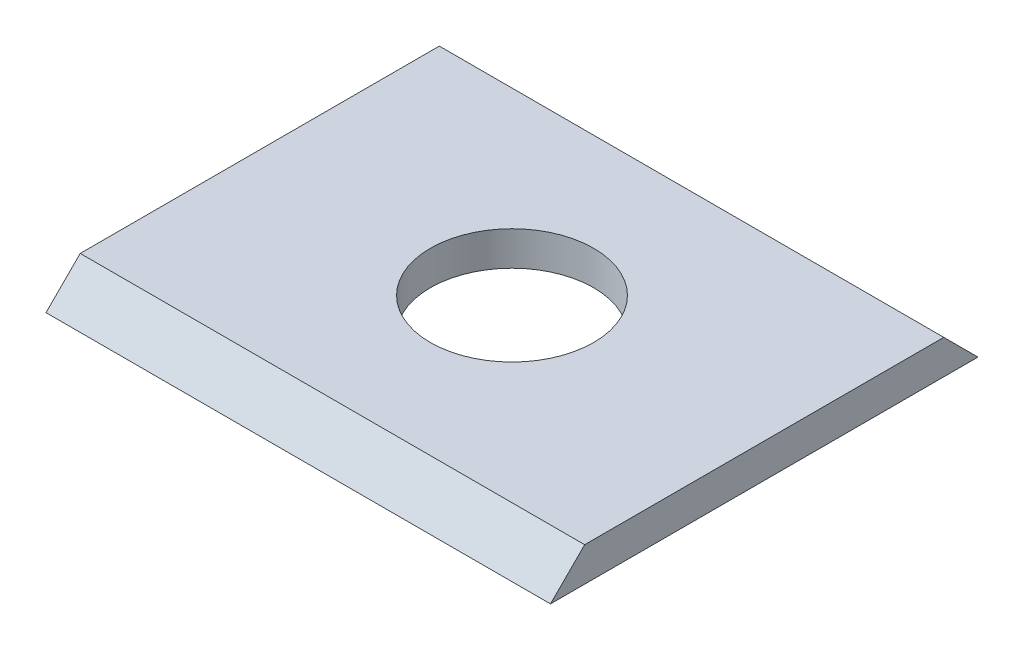
ISO-10303-21;
HEADER;
FILE_DESCRIPTION(('STEP AP214'),'2;1');
FILE_NAME('part.step','',(''),(''),'','','');
FILE_SCHEMA(('AUTOMOTIVE_DESIGN { 1 0 10303 214 1 1 1 1 }'));
ENDSEC;
DATA;
#1=APPLICATION_CONTEXT('core data for automotive mechanical design processes');
#2=APPLICATION_PROTOCOL_DEFINITION('international standard','automotive_design',2000,#1);
#3=PRODUCT_CONTEXT('',#1,'mechanical');
#4=PRODUCT('Part','Part','',(#3));
#5=PRODUCT_RELATED_PRODUCT_CATEGORY('part','',(#4));
#6=PRODUCT_DEFINITION_FORMATION('','',#4);
#7=PRODUCT_DEFINITION_CONTEXT('part definition',#1,'design');
#8=PRODUCT_DEFINITION('design','',#6,#7);
#9=PRODUCT_DEFINITION_SHAPE('','',#8);
#10=(LENGTH_UNIT() NAMED_UNIT(*) SI_UNIT(.MILLI.,.METRE.));
#11=(NAMED_UNIT(*) PLANE_ANGLE_UNIT() SI_UNIT($,.RADIAN.));
#12=(NAMED_UNIT(*) SI_UNIT($,.STERADIAN.) SOLID_ANGLE_UNIT());
#13=UNCERTAINTY_MEASURE_WITH_UNIT(LENGTH_MEASURE(1.E-05),#10,'distance_accuracy_value','');
#14=(GEOMETRIC_REPRESENTATION_CONTEXT(3) GLOBAL_UNCERTAINTY_ASSIGNED_CONTEXT((#13)) GLOBAL_UNIT_ASSIGNED_CONTEXT((#10,
#11,#12)) REPRESENTATION_CONTEXT('',''));
#15=CARTESIAN_POINT('',(0.,0.,0.));
#16=DIRECTION('',(0.,0.,1.));
#17=DIRECTION('',(1.,0.,0.));
#18=AXIS2_PLACEMENT_3D('',#15,#16,#17);
#19=CARTESIAN_POINT('',(59.,4.,0.));
#20=DIRECTION('',(-1.,0.,0.));
#21=DIRECTION('',(0.,0.,1.));
#22=AXIS2_PLACEMENT_3D('',#19,#20,#21);
#23=PLANE('',#22);
#24=DIRECTION('',(0.,0.,-1.));
#25=VECTOR('',#24,1.);
#26=CARTESIAN_POINT('',(59.,0.,0.));
#27=LINE('',#26,#25);
#28=CARTESIAN_POINT('',(59.,0.,0.));
#29=VERTEX_POINT('',#28);
#30=CARTESIAN_POINT('',(59.,0.,-50.));
#31=VERTEX_POINT('',#30);
#32=EDGE_CURVE('E81',#29,#31,#27,.T.);
#33=ORIENTED_EDGE('',*,*,#32,.T.);
#34=DIRECTION('',(0.,0.707106781186549,0.707106781186546));
#35=VECTOR('',#34,1.);
#36=CARTESIAN_POINT('',(59.,4.,-46.));
#37=LINE('',#36,#35);
#38=CARTESIAN_POINT('',(59.,4.,-46.));
#39=VERTEX_POINT('',#38);
#40=EDGE_CURVE('E11',#31,#39,#37,.T.);
#41=ORIENTED_EDGE('',*,*,#40,.T.);
#42=DIRECTION('',(0.,0.,-1.));
#43=VECTOR('',#42,1.);
#44=CARTESIAN_POINT('',(59.,4.,0.));
#45=LINE('',#44,#43);
#46=CARTESIAN_POINT('',(59.,4.,-4.00000000000001));
#47=VERTEX_POINT('',#46);
#48=EDGE_CURVE('E104',#47,#39,#45,.T.);
#49=ORIENTED_EDGE('',*,*,#48,.F.);
#50=DIRECTION('',(0.,-0.707106781186548,0.707106781186547));
#51=VECTOR('',#50,1.);
#52=CARTESIAN_POINT('',(59.,4.,-4.00000000000001));
#53=LINE('',#52,#51);
#54=EDGE_CURVE('E43',#47,#29,#53,.T.);
#55=ORIENTED_EDGE('',*,*,#54,.T.);
#56=EDGE_LOOP('',(#33,#41,#49,#55));
#57=FACE_BOUND('',#56,.T.);
#58=ADVANCED_FACE('F35',(#57),#23,.F.);
#59=CARTESIAN_POINT('',(0.,4.,0.));
#60=DIRECTION('',(-1.,0.,0.));
#61=DIRECTION('',(0.,0.,1.));
#62=AXIS2_PLACEMENT_3D('',#59,#60,#61);
#63=PLANE('',#62);
#64=DIRECTION('',(0.,0.,-1.));
#65=VECTOR('',#64,1.);
#66=CARTESIAN_POINT('',(0.,4.,0.));
#67=LINE('',#66,#65);
#68=CARTESIAN_POINT('',(0.,4.,-4.00000000000001));
#69=VERTEX_POINT('',#68);
#70=CARTESIAN_POINT('',(0.,4.,-46.));
#71=VERTEX_POINT('',#70);
#72=EDGE_CURVE('E98',#69,#71,#67,.T.);
#73=ORIENTED_EDGE('',*,*,#72,.T.);
#74=DIRECTION('',(0.,-0.707106781186549,-0.707106781186546));
#75=VECTOR('',#74,1.);
#76=CARTESIAN_POINT('',(0.,27.,-23.0000000000001));
#77=LINE('',#76,#75);
#78=CARTESIAN_POINT('',(0.,0.,-50.));
#79=VERTEX_POINT('',#78);
#80=EDGE_CURVE('E50',#71,#79,#77,.T.);
#81=ORIENTED_EDGE('',*,*,#80,.T.);
#82=DIRECTION('',(0.,0.,-1.));
#83=VECTOR('',#82,1.);
#84=CARTESIAN_POINT('',(0.,0.,0.));
#85=LINE('',#84,#83);
#86=CARTESIAN_POINT('',(0.,0.,0.));
#87=VERTEX_POINT('',#86);
#88=EDGE_CURVE('E83',#87,#79,#85,.T.);
#89=ORIENTED_EDGE('',*,*,#88,.F.);
#90=DIRECTION('',(0.,0.707106781186548,-0.707106781186547));
#91=VECTOR('',#90,1.);
#92=CARTESIAN_POINT('',(0.,1.99999999999999,-2.00000000000001));
#93=LINE('',#92,#91);
#94=EDGE_CURVE('E58',#87,#69,#93,.T.);
#95=ORIENTED_EDGE('',*,*,#94,.T.);
#96=EDGE_LOOP('',(#73,#81,#89,#95));
#97=FACE_BOUND('',#96,.T.);
#98=ADVANCED_FACE('F102',(#97),#63,.T.);
#99=CARTESIAN_POINT('',(29.5,4.,-25.));
#100=DIRECTION('',(0.,-1.,0.));
#101=DIRECTION('',(0.,0.,-1.));
#102=AXIS2_PLACEMENT_3D('',#99,#100,#101);
#103=CYLINDRICAL_SURFACE('',#102,9.55);
#104=CARTESIAN_POINT('',(29.5,4.,-25.));
#105=DIRECTION('',(0.,1.,0.));
#106=DIRECTION('',(0.,0.,1.));
#107=AXIS2_PLACEMENT_3D('',#104,#105,#106);
#108=CIRCLE('',#107,9.55);
#109=CARTESIAN_POINT('',(29.5,4.,-15.45));
#110=VERTEX_POINT('',#109);
#111=EDGE_CURVE('E106',#110,#110,#108,.T.);
#112=ORIENTED_EDGE('',*,*,#111,.T.);
#113=EDGE_LOOP('',(#112));
#114=FACE_BOUND('',#113,.T.);
#115=CARTESIAN_POINT('',(29.5,0.,-25.));
#116=DIRECTION('',(0.,1.,0.));
#117=DIRECTION('',(0.,0.,1.));
#118=AXIS2_PLACEMENT_3D('',#115,#116,#117);
#119=CIRCLE('',#118,9.55);
#120=CARTESIAN_POINT('',(29.5,0.,-15.45));
#121=VERTEX_POINT('',#120);
#122=EDGE_CURVE('E89',#121,#121,#119,.T.);
#123=ORIENTED_EDGE('',*,*,#122,.F.);
#124=EDGE_LOOP('',(#123));
#125=FACE_BOUND('',#124,.T.);
#126=ADVANCED_FACE('F117',(#114,#125),#103,.F.);
#127=CARTESIAN_POINT('',(0.,4.,0.));
#128=DIRECTION('',(0.,1.,0.));
#129=DIRECTION('',(0.,0.,1.));
#130=AXIS2_PLACEMENT_3D('',#127,#128,#129);
#131=PLANE('',#130);
#132=ORIENTED_EDGE('',*,*,#111,.F.);
#133=EDGE_LOOP('',(#132));
#134=FACE_BOUND('',#133,.T.);
#135=ORIENTED_EDGE('',*,*,#48,.T.);
#136=DIRECTION('',(-1.,0.,0.));
#137=VECTOR('',#136,1.);
#138=CARTESIAN_POINT('',(0.,4.,-46.));
#139=LINE('',#138,#137);
#140=EDGE_CURVE('E92',#39,#71,#139,.T.);
#141=ORIENTED_EDGE('',*,*,#140,.T.);
#142=ORIENTED_EDGE('',*,*,#72,.F.);
#143=DIRECTION('',(1.,0.,0.));
#144=VECTOR('',#143,1.);
#145=CARTESIAN_POINT('',(59.,4.,-4.00000000000001));
#146=LINE('',#145,#144);
#147=EDGE_CURVE('E94',#69,#47,#146,.T.);
#148=ORIENTED_EDGE('',*,*,#147,.T.);
#149=EDGE_LOOP('',(#135,#141,#142,#148));
#150=FACE_BOUND('',#149,.T.);
#151=ADVANCED_FACE('F120',(#134,#150),#131,.T.);
#152=CARTESIAN_POINT('',(0.,0.,0.));
#153=DIRECTION('',(0.,1.,0.));
#154=DIRECTION('',(0.,0.,1.));
#155=AXIS2_PLACEMENT_3D('',#152,#153,#154);
#156=PLANE('',#155);
#157=ORIENTED_EDGE('',*,*,#122,.T.);
#158=EDGE_LOOP('',(#157));
#159=FACE_BOUND('',#158,.T.);
#160=ORIENTED_EDGE('',*,*,#32,.F.);
#161=DIRECTION('',(1.,0.,0.));
#162=VECTOR('',#161,1.);
#163=CARTESIAN_POINT('',(0.,0.,0.));
#164=LINE('',#163,#162);
#165=EDGE_CURVE('E112',#87,#29,#164,.T.);
#166=ORIENTED_EDGE('',*,*,#165,.F.);
#167=ORIENTED_EDGE('',*,*,#88,.T.);
#168=DIRECTION('',(-1.,0.,0.));
#169=VECTOR('',#168,1.);
#170=CARTESIAN_POINT('',(0.,0.,-50.));
#171=LINE('',#170,#169);
#172=EDGE_CURVE('E78',#31,#79,#171,.T.);
#173=ORIENTED_EDGE('',*,*,#172,.F.);
#174=EDGE_LOOP('',(#160,#166,#167,#173));
#175=FACE_BOUND('',#174,.T.);
#176=ADVANCED_FACE('F80',(#159,#175),#156,.F.);
#177=CARTESIAN_POINT('',(0.,4.,-46.));
#178=DIRECTION('',(0.,0.707106781186546,-0.707106781186549));
#179=DIRECTION('',(1.,0.,0.));
#180=AXIS2_PLACEMENT_3D('',#177,#178,#179);
#181=PLANE('',#180);
#182=ORIENTED_EDGE('',*,*,#40,.F.);
#183=ORIENTED_EDGE('',*,*,#172,.T.);
#184=ORIENTED_EDGE('',*,*,#80,.F.);
#185=ORIENTED_EDGE('',*,*,#140,.F.);
#186=EDGE_LOOP('',(#182,#183,#184,#185));
#187=FACE_BOUND('',#186,.T.);
#188=ADVANCED_FACE('F91',(#187),#181,.T.);
#189=CARTESIAN_POINT('',(0.,4.,-4.00000000000001));
#190=DIRECTION('',(0.,0.707106781186547,0.707106781186548));
#191=DIRECTION('',(-1.,0.,0.));
#192=AXIS2_PLACEMENT_3D('',#189,#190,#191);
#193=PLANE('',#192);
#194=ORIENTED_EDGE('',*,*,#94,.F.);
#195=ORIENTED_EDGE('',*,*,#165,.T.);
#196=ORIENTED_EDGE('',*,*,#54,.F.);
#197=ORIENTED_EDGE('',*,*,#147,.F.);
#198=EDGE_LOOP('',(#194,#195,#196,#197));
#199=FACE_BOUND('',#198,.T.);
#200=ADVANCED_FACE('F37',(#199),#193,.T.);
#201=CLOSED_SHELL('',(#58,#98,#126,#151,#176,#188,#200));
#202=MANIFOLD_SOLID_BREP('B2',#201);
#203=ADVANCED_BREP_SHAPE_REPRESENTATION('',(#18,#202),#14);
#204=SHAPE_DEFINITION_REPRESENTATION(#9,#203);
ENDSEC;
END-ISO-10303-21;
